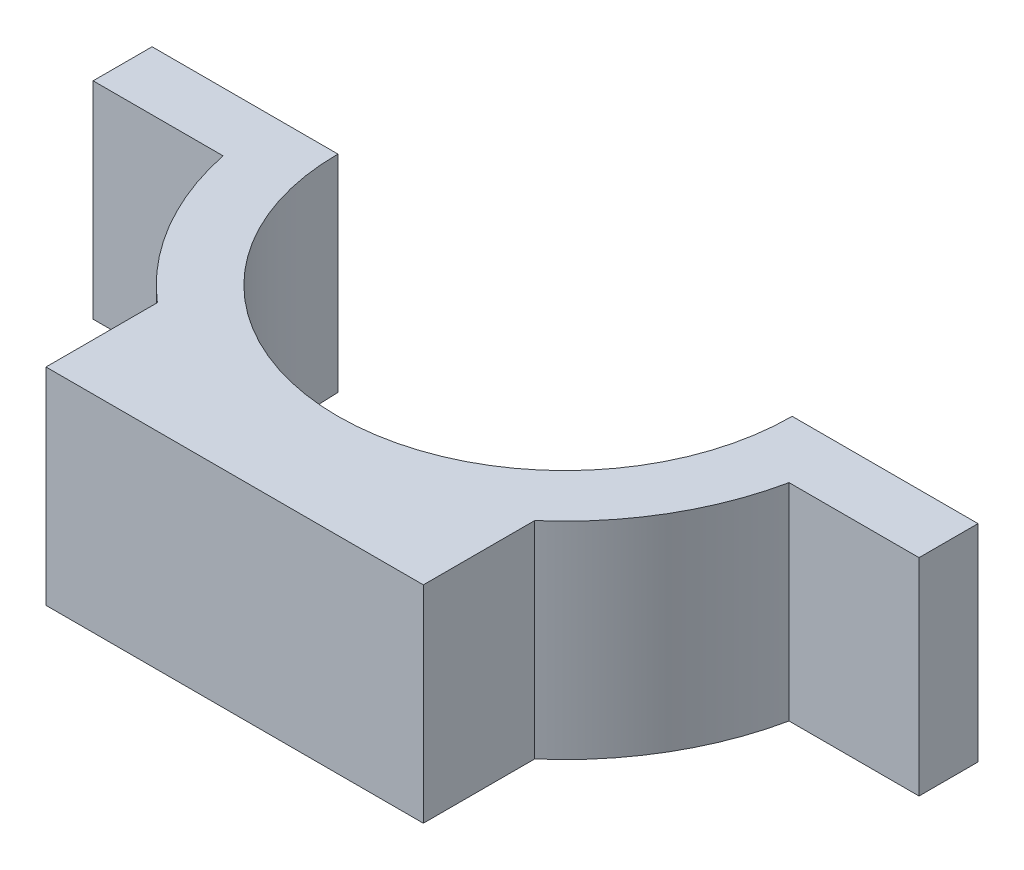
ISO-10303-21;
HEADER;
FILE_DESCRIPTION(('STEP AP214'),'2;1');
FILE_NAME('part.step','',(''),(''),'','','');
FILE_SCHEMA(('AUTOMOTIVE_DESIGN { 1 0 10303 214 1 1 1 1 }'));
ENDSEC;
DATA;
#1=APPLICATION_CONTEXT('core data for automotive mechanical design processes');
#2=APPLICATION_PROTOCOL_DEFINITION('international standard','automotive_design',2000,#1);
#3=PRODUCT_CONTEXT('',#1,'mechanical');
#4=PRODUCT('Part','Part','',(#3));
#5=PRODUCT_RELATED_PRODUCT_CATEGORY('part','',(#4));
#6=PRODUCT_DEFINITION_FORMATION('','',#4);
#7=PRODUCT_DEFINITION_CONTEXT('part definition',#1,'design');
#8=PRODUCT_DEFINITION('design','',#6,#7);
#9=PRODUCT_DEFINITION_SHAPE('','',#8);
#10=(LENGTH_UNIT() NAMED_UNIT(*) SI_UNIT(.MILLI.,.METRE.));
#11=(NAMED_UNIT(*) PLANE_ANGLE_UNIT() SI_UNIT($,.RADIAN.));
#12=(NAMED_UNIT(*) SI_UNIT($,.STERADIAN.) SOLID_ANGLE_UNIT());
#13=UNCERTAINTY_MEASURE_WITH_UNIT(LENGTH_MEASURE(1.E-05),#10,'distance_accuracy_value','');
#14=(GEOMETRIC_REPRESENTATION_CONTEXT(3) GLOBAL_UNCERTAINTY_ASSIGNED_CONTEXT((#13)) GLOBAL_UNIT_ASSIGNED_CONTEXT((#10,
#11,#12)) REPRESENTATION_CONTEXT('',''));
#15=CARTESIAN_POINT('',(0.,0.,0.));
#16=DIRECTION('',(0.,0.,1.));
#17=DIRECTION('',(1.,0.,0.));
#18=AXIS2_PLACEMENT_3D('',#15,#16,#17);
#19=CARTESIAN_POINT('',(0.,50.,0.));
#20=DIRECTION('',(0.,-1.,0.));
#21=DIRECTION('',(0.,0.,-1.));
#22=AXIS2_PLACEMENT_3D('',#19,#20,#21);
#23=CYLINDRICAL_SURFACE('',#22,55.);
#24=CARTESIAN_POINT('',(0.,50.,0.));
#25=DIRECTION('',(0.,1.,0.));
#26=DIRECTION('',(0.,0.,1.));
#27=AXIS2_PLACEMENT_3D('',#24,#25,#26);
#28=CIRCLE('',#27,55.);
#29=CARTESIAN_POINT('',(-55.,50.,0.));
#30=VERTEX_POINT('',#29);
#31=CARTESIAN_POINT('',(55.,50.,0.));
#32=VERTEX_POINT('',#31);
#33=EDGE_CURVE('E208',#30,#32,#28,.T.);
#34=ORIENTED_EDGE('',*,*,#33,.T.);
#35=DIRECTION('',(0.,1.,0.));
#36=VECTOR('',#35,1.);
#37=CARTESIAN_POINT('',(55.,-150.,0.));
#38=LINE('',#37,#36);
#39=CARTESIAN_POINT('',(55.,0.,0.));
#40=VERTEX_POINT('',#39);
#41=EDGE_CURVE('E167',#40,#32,#38,.T.);
#42=ORIENTED_EDGE('',*,*,#41,.F.);
#43=CARTESIAN_POINT('',(0.,0.,0.));
#44=DIRECTION('',(0.,1.,0.));
#45=DIRECTION('',(0.,0.,1.));
#46=AXIS2_PLACEMENT_3D('',#43,#44,#45);
#47=CIRCLE('',#46,55.);
#48=CARTESIAN_POINT('',(-55.,0.,0.));
#49=VERTEX_POINT('',#48);
#50=EDGE_CURVE('E207',#49,#40,#47,.T.);
#51=ORIENTED_EDGE('',*,*,#50,.F.);
#52=DIRECTION('',(0.,1.,0.));
#53=VECTOR('',#52,1.);
#54=CARTESIAN_POINT('',(-55.,-150.,0.));
#55=LINE('',#54,#53);
#56=EDGE_CURVE('E164',#30,#49,#55,.F.);
#57=ORIENTED_EDGE('',*,*,#56,.F.);
#58=EDGE_LOOP('',(#34,#42,#51,#57));
#59=FACE_BOUND('',#58,.T.);
#60=ADVANCED_FACE('F45',(#59),#23,.F.);
#61=CARTESIAN_POINT('',(0.,50.,0.));
#62=DIRECTION('',(0.,-1.,0.));
#63=DIRECTION('',(0.,0.,-1.));
#64=AXIS2_PLACEMENT_3D('',#61,#62,#63);
#65=CYLINDRICAL_SURFACE('',#64,70.);
#66=DIRECTION('',(0.,-1.,0.));
#67=VECTOR('',#66,1.);
#68=CARTESIAN_POINT('',(45.6895550732827,50.,53.0326744300669));
#69=LINE('',#68,#67);
#70=CARTESIAN_POINT('',(45.6895550732827,0.,53.0326744300669));
#71=VERTEX_POINT('',#70);
#72=CARTESIAN_POINT('',(45.6895550732827,50.,53.0326744300669));
#73=VERTEX_POINT('',#72);
#74=EDGE_CURVE('E156',#71,#73,#69,.F.);
#75=ORIENTED_EDGE('',*,*,#74,.F.);
#76=CARTESIAN_POINT('',(0.,0.,0.));
#77=DIRECTION('',(0.,1.,0.));
#78=DIRECTION('',(0.,0.,1.));
#79=AXIS2_PLACEMENT_3D('',#76,#77,#78);
#80=CIRCLE('',#79,70.);
#81=CARTESIAN_POINT('',(68.5275141136973,0.,14.2821500271149));
#82=VERTEX_POINT('',#81);
#83=EDGE_CURVE('E214',#71,#82,#80,.T.);
#84=ORIENTED_EDGE('',*,*,#83,.T.);
#85=DIRECTION('',(0.,-1.,0.));
#86=VECTOR('',#85,1.);
#87=CARTESIAN_POINT('',(68.5275141136973,50.,14.2821500271149));
#88=LINE('',#87,#86);
#89=CARTESIAN_POINT('',(68.5275141136973,50.,14.2821500271149));
#90=VERTEX_POINT('',#89);
#91=EDGE_CURVE('E204',#90,#82,#88,.T.);
#92=ORIENTED_EDGE('',*,*,#91,.F.);
#93=CARTESIAN_POINT('',(0.,50.,0.));
#94=DIRECTION('',(0.,1.,0.));
#95=DIRECTION('',(0.,0.,1.));
#96=AXIS2_PLACEMENT_3D('',#93,#94,#95);
#97=CIRCLE('',#96,70.);
#98=EDGE_CURVE('E53',#73,#90,#97,.T.);
#99=ORIENTED_EDGE('',*,*,#98,.F.);
#100=EDGE_LOOP('',(#75,#84,#92,#99));
#101=FACE_BOUND('',#100,.T.);
#102=ADVANCED_FACE('F222',(#101),#65,.T.);
#103=DIRECTION('',(0.,-1.,0.));
#104=VECTOR('',#103,1.);
#105=CARTESIAN_POINT('',(-45.6895550732827,50.,53.0326744300669));
#106=LINE('',#105,#104);
#107=CARTESIAN_POINT('',(-45.6895550732827,50.,53.0326744300669));
#108=VERTEX_POINT('',#107);
#109=CARTESIAN_POINT('',(-45.6895550732827,0.,53.0326744300669));
#110=VERTEX_POINT('',#109);
#111=EDGE_CURVE('E68',#108,#110,#106,.T.);
#112=ORIENTED_EDGE('',*,*,#111,.F.);
#113=CARTESIAN_POINT('',(-68.5275141136973,50.,14.2821500271149));
#114=VERTEX_POINT('',#113);
#115=EDGE_CURVE('E11',#114,#108,#97,.T.);
#116=ORIENTED_EDGE('',*,*,#115,.F.);
#117=DIRECTION('',(0.,-1.,0.));
#118=VECTOR('',#117,1.);
#119=CARTESIAN_POINT('',(-68.5275141136973,50.,14.2821500271149));
#120=LINE('',#119,#118);
#121=CARTESIAN_POINT('',(-68.5275141136973,0.,14.2821500271149));
#122=VERTEX_POINT('',#121);
#123=EDGE_CURVE('E197',#122,#114,#120,.F.);
#124=ORIENTED_EDGE('',*,*,#123,.F.);
#125=EDGE_CURVE('E48',#122,#110,#80,.T.);
#126=ORIENTED_EDGE('',*,*,#125,.T.);
#127=EDGE_LOOP('',(#112,#116,#124,#126));
#128=FACE_BOUND('',#127,.T.);
#129=ADVANCED_FACE('F249',(#128),#65,.T.);
#130=CARTESIAN_POINT('',(0.,50.,0.));
#131=DIRECTION('',(0.,0.,1.));
#132=DIRECTION('',(1.,0.,0.));
#133=AXIS2_PLACEMENT_3D('',#130,#131,#132);
#134=PLANE('',#133);
#135=DIRECTION('',(-1.,0.,0.));
#136=VECTOR('',#135,1.);
#137=CARTESIAN_POINT('',(0.,0.,0.));
#138=LINE('',#137,#136);
#139=CARTESIAN_POINT('',(100.,0.,0.));
#140=VERTEX_POINT('',#139);
#141=EDGE_CURVE('E211',#140,#40,#138,.T.);
#142=ORIENTED_EDGE('',*,*,#141,.T.);
#143=ORIENTED_EDGE('',*,*,#41,.T.);
#144=DIRECTION('',(-1.,0.,0.));
#145=VECTOR('',#144,1.);
#146=CARTESIAN_POINT('',(0.,50.,0.));
#147=LINE('',#146,#145);
#148=CARTESIAN_POINT('',(100.,50.,0.));
#149=VERTEX_POINT('',#148);
#150=EDGE_CURVE('E212',#149,#32,#147,.T.);
#151=ORIENTED_EDGE('',*,*,#150,.F.);
#152=DIRECTION('',(0.,-1.,0.));
#153=VECTOR('',#152,1.);
#154=CARTESIAN_POINT('',(100.,50.,0.));
#155=LINE('',#154,#153);
#156=EDGE_CURVE('E174',#149,#140,#155,.T.);
#157=ORIENTED_EDGE('',*,*,#156,.T.);
#158=EDGE_LOOP('',(#142,#143,#151,#157));
#159=FACE_BOUND('',#158,.T.);
#160=ADVANCED_FACE('F234',(#159),#134,.F.);
#161=CARTESIAN_POINT('',(-100.,50.,0.));
#162=VERTEX_POINT('',#161);
#163=EDGE_CURVE('E210',#30,#162,#147,.T.);
#164=ORIENTED_EDGE('',*,*,#163,.F.);
#165=ORIENTED_EDGE('',*,*,#56,.T.);
#166=CARTESIAN_POINT('',(-100.,0.,0.));
#167=VERTEX_POINT('',#166);
#168=EDGE_CURVE('E216',#49,#167,#138,.T.);
#169=ORIENTED_EDGE('',*,*,#168,.T.);
#170=DIRECTION('',(0.,-1.,0.));
#171=VECTOR('',#170,1.);
#172=CARTESIAN_POINT('',(-100.,50.,0.));
#173=LINE('',#172,#171);
#174=EDGE_CURVE('E186',#162,#167,#173,.T.);
#175=ORIENTED_EDGE('',*,*,#174,.F.);
#176=EDGE_LOOP('',(#164,#165,#169,#175));
#177=FACE_BOUND('',#176,.T.);
#178=ADVANCED_FACE('F240',(#177),#134,.F.);
#179=CARTESIAN_POINT('',(0.,50.,0.));
#180=DIRECTION('',(0.,1.,0.));
#181=DIRECTION('',(0.,0.,1.));
#182=AXIS2_PLACEMENT_3D('',#179,#180,#181);
#183=PLANE('',#182);
#184=ORIENTED_EDGE('',*,*,#150,.T.);
#185=ORIENTED_EDGE('',*,*,#33,.F.);
#186=ORIENTED_EDGE('',*,*,#163,.T.);
#187=DIRECTION('',(0.,0.,-1.));
#188=VECTOR('',#187,1.);
#189=CARTESIAN_POINT('',(-100.,50.,14.2821500271149));
#190=LINE('',#189,#188);
#191=CARTESIAN_POINT('',(-100.,50.,14.2821500271149));
#192=VERTEX_POINT('',#191);
#193=EDGE_CURVE('E170',#192,#162,#190,.T.);
#194=ORIENTED_EDGE('',*,*,#193,.F.);
#195=DIRECTION('',(-1.,0.,0.));
#196=VECTOR('',#195,1.);
#197=CARTESIAN_POINT('',(100.,50.,14.2821500271149));
#198=LINE('',#197,#196);
#199=EDGE_CURVE('E198',#114,#192,#198,.T.);
#200=ORIENTED_EDGE('',*,*,#199,.F.);
#201=ORIENTED_EDGE('',*,*,#115,.T.);
#202=DIRECTION('',(0.,0.,-1.));
#203=VECTOR('',#202,1.);
#204=CARTESIAN_POINT('',(-45.6895550732827,50.,80.));
#205=LINE('',#204,#203);
#206=CARTESIAN_POINT('',(-45.6895550732827,50.,80.));
#207=VERTEX_POINT('',#206);
#208=EDGE_CURVE('E141',#207,#108,#205,.T.);
#209=ORIENTED_EDGE('',*,*,#208,.F.);
#210=DIRECTION('',(-1.,0.,0.));
#211=VECTOR('',#210,1.);
#212=CARTESIAN_POINT('',(-45.6895550732827,50.,80.));
#213=LINE('',#212,#211);
#214=CARTESIAN_POINT('',(45.6895550732827,50.,80.));
#215=VERTEX_POINT('',#214);
#216=EDGE_CURVE('E134',#215,#207,#213,.T.);
#217=ORIENTED_EDGE('',*,*,#216,.F.);
#218=DIRECTION('',(0.,0.,-1.));
#219=VECTOR('',#218,1.);
#220=CARTESIAN_POINT('',(45.6895550732827,50.,80.));
#221=LINE('',#220,#219);
#222=EDGE_CURVE('E139',#215,#73,#221,.T.);
#223=ORIENTED_EDGE('',*,*,#222,.T.);
#224=ORIENTED_EDGE('',*,*,#98,.T.);
#225=CARTESIAN_POINT('',(100.,50.,14.2821500271149));
#226=VERTEX_POINT('',#225);
#227=EDGE_CURVE('E194',#226,#90,#198,.T.);
#228=ORIENTED_EDGE('',*,*,#227,.F.);
#229=DIRECTION('',(0.,0.,-1.));
#230=VECTOR('',#229,1.);
#231=CARTESIAN_POINT('',(100.,50.,14.2821500271149));
#232=LINE('',#231,#230);
#233=EDGE_CURVE('E171',#226,#149,#232,.T.);
#234=ORIENTED_EDGE('',*,*,#233,.T.);
#235=EDGE_LOOP('',(#184,#185,#186,#194,#200,#201,#209,#217,#223,#224,#228,#234));
#236=FACE_BOUND('',#235,.T.);
#237=ADVANCED_FACE('F137',(#236),#183,.T.);
#238=CARTESIAN_POINT('',(0.,0.,0.));
#239=DIRECTION('',(0.,1.,0.));
#240=DIRECTION('',(0.,0.,1.));
#241=AXIS2_PLACEMENT_3D('',#238,#239,#240);
#242=PLANE('',#241);
#243=ORIENTED_EDGE('',*,*,#50,.T.);
#244=ORIENTED_EDGE('',*,*,#141,.F.);
#245=DIRECTION('',(0.,0.,-1.));
#246=VECTOR('',#245,1.);
#247=CARTESIAN_POINT('',(100.,0.,14.2821500271149));
#248=LINE('',#247,#246);
#249=CARTESIAN_POINT('',(100.,0.,14.2821500271149));
#250=VERTEX_POINT('',#249);
#251=EDGE_CURVE('E178',#250,#140,#248,.T.);
#252=ORIENTED_EDGE('',*,*,#251,.F.);
#253=DIRECTION('',(-1.,0.,0.));
#254=VECTOR('',#253,1.);
#255=CARTESIAN_POINT('',(100.,0.,14.2821500271149));
#256=LINE('',#255,#254);
#257=EDGE_CURVE('E199',#250,#82,#256,.T.);
#258=ORIENTED_EDGE('',*,*,#257,.T.);
#259=ORIENTED_EDGE('',*,*,#83,.F.);
#260=DIRECTION('',(0.,0.,-1.));
#261=VECTOR('',#260,1.);
#262=CARTESIAN_POINT('',(45.6895550732827,0.,80.));
#263=LINE('',#262,#261);
#264=CARTESIAN_POINT('',(45.6895550732827,0.,80.));
#265=VERTEX_POINT('',#264);
#266=EDGE_CURVE('E253',#265,#71,#263,.T.);
#267=ORIENTED_EDGE('',*,*,#266,.F.);
#268=DIRECTION('',(1.,0.,0.));
#269=VECTOR('',#268,1.);
#270=CARTESIAN_POINT('',(-45.6895550732827,0.,80.));
#271=LINE('',#270,#269);
#272=CARTESIAN_POINT('',(-45.6895550732827,0.,80.));
#273=VERTEX_POINT('',#272);
#274=EDGE_CURVE('E150',#273,#265,#271,.T.);
#275=ORIENTED_EDGE('',*,*,#274,.F.);
#276=DIRECTION('',(0.,0.,-1.));
#277=VECTOR('',#276,1.);
#278=CARTESIAN_POINT('',(-45.6895550732827,0.,80.));
#279=LINE('',#278,#277);
#280=EDGE_CURVE('E159',#273,#110,#279,.T.);
#281=ORIENTED_EDGE('',*,*,#280,.T.);
#282=ORIENTED_EDGE('',*,*,#125,.F.);
#283=CARTESIAN_POINT('',(-100.,0.,14.2821500271149));
#284=VERTEX_POINT('',#283);
#285=EDGE_CURVE('E183',#122,#284,#256,.T.);
#286=ORIENTED_EDGE('',*,*,#285,.T.);
#287=DIRECTION('',(0.,0.,-1.));
#288=VECTOR('',#287,1.);
#289=CARTESIAN_POINT('',(-100.,0.,14.2821500271149));
#290=LINE('',#289,#288);
#291=EDGE_CURVE('E189',#284,#167,#290,.T.);
#292=ORIENTED_EDGE('',*,*,#291,.T.);
#293=ORIENTED_EDGE('',*,*,#168,.F.);
#294=EDGE_LOOP('',(#243,#244,#252,#258,#259,#267,#275,#281,#282,#286,#292,#293));
#295=FACE_BOUND('',#294,.T.);
#296=ADVANCED_FACE('F229',(#295),#242,.F.);
#297=CARTESIAN_POINT('',(-100.,0.,0.));
#298=DIRECTION('',(-1.,0.,0.));
#299=DIRECTION('',(0.,0.,1.));
#300=AXIS2_PLACEMENT_3D('',#297,#298,#299);
#301=PLANE('',#300);
#302=ORIENTED_EDGE('',*,*,#193,.T.);
#303=ORIENTED_EDGE('',*,*,#174,.T.);
#304=ORIENTED_EDGE('',*,*,#291,.F.);
#305=DIRECTION('',(0.,-1.,0.));
#306=VECTOR('',#305,1.);
#307=CARTESIAN_POINT('',(-100.,50.,14.2821500271149));
#308=LINE('',#307,#306);
#309=EDGE_CURVE('E175',#192,#284,#308,.T.);
#310=ORIENTED_EDGE('',*,*,#309,.F.);
#311=EDGE_LOOP('',(#302,#303,#304,#310));
#312=FACE_BOUND('',#311,.T.);
#313=ADVANCED_FACE('F244',(#312),#301,.T.);
#314=CARTESIAN_POINT('',(100.,50.,14.2821500271149));
#315=DIRECTION('',(0.,0.,-1.));
#316=DIRECTION('',(-1.,0.,0.));
#317=AXIS2_PLACEMENT_3D('',#314,#315,#316);
#318=PLANE('',#317);
#319=ORIENTED_EDGE('',*,*,#285,.F.);
#320=ORIENTED_EDGE('',*,*,#123,.T.);
#321=ORIENTED_EDGE('',*,*,#199,.T.);
#322=ORIENTED_EDGE('',*,*,#309,.T.);
#323=EDGE_LOOP('',(#319,#320,#321,#322));
#324=FACE_BOUND('',#323,.T.);
#325=ADVANCED_FACE('F248',(#324),#318,.F.);
#326=CARTESIAN_POINT('',(100.,0.,0.));
#327=DIRECTION('',(-1.,0.,0.));
#328=DIRECTION('',(0.,0.,1.));
#329=AXIS2_PLACEMENT_3D('',#326,#327,#328);
#330=PLANE('',#329);
#331=ORIENTED_EDGE('',*,*,#233,.F.);
#332=DIRECTION('',(0.,-1.,0.));
#333=VECTOR('',#332,1.);
#334=CARTESIAN_POINT('',(100.,50.,14.2821500271149));
#335=LINE('',#334,#333);
#336=EDGE_CURVE('E181',#226,#250,#335,.T.);
#337=ORIENTED_EDGE('',*,*,#336,.T.);
#338=ORIENTED_EDGE('',*,*,#251,.T.);
#339=ORIENTED_EDGE('',*,*,#156,.F.);
#340=EDGE_LOOP('',(#331,#337,#338,#339));
#341=FACE_BOUND('',#340,.T.);
#342=ADVANCED_FACE('F233',(#341),#330,.F.);
#343=ORIENTED_EDGE('',*,*,#227,.T.);
#344=ORIENTED_EDGE('',*,*,#91,.T.);
#345=ORIENTED_EDGE('',*,*,#257,.F.);
#346=ORIENTED_EDGE('',*,*,#336,.F.);
#347=EDGE_LOOP('',(#343,#344,#345,#346));
#348=FACE_BOUND('',#347,.T.);
#349=ADVANCED_FACE('F226',(#348),#318,.F.);
#350=CARTESIAN_POINT('',(0.,0.,80.));
#351=DIRECTION('',(0.,0.,1.));
#352=DIRECTION('',(1.,0.,0.));
#353=AXIS2_PLACEMENT_3D('',#350,#351,#352);
#354=PLANE('',#353);
#355=DIRECTION('',(0.,1.,0.));
#356=VECTOR('',#355,1.);
#357=CARTESIAN_POINT('',(45.6895550732827,50.,80.));
#358=LINE('',#357,#356);
#359=EDGE_CURVE('E145',#265,#215,#358,.T.);
#360=ORIENTED_EDGE('',*,*,#359,.T.);
#361=ORIENTED_EDGE('',*,*,#216,.T.);
#362=DIRECTION('',(0.,-1.,0.));
#363=VECTOR('',#362,1.);
#364=CARTESIAN_POINT('',(-45.6895550732827,50.,80.));
#365=LINE('',#364,#363);
#366=EDGE_CURVE('E144',#207,#273,#365,.T.);
#367=ORIENTED_EDGE('',*,*,#366,.T.);
#368=ORIENTED_EDGE('',*,*,#274,.T.);
#369=EDGE_LOOP('',(#360,#361,#367,#368));
#370=FACE_BOUND('',#369,.T.);
#371=ADVANCED_FACE('F148',(#370),#354,.T.);
#372=CARTESIAN_POINT('',(-45.6895550732827,50.,80.));
#373=DIRECTION('',(1.,0.,0.));
#374=DIRECTION('',(0.,0.,-1.));
#375=AXIS2_PLACEMENT_3D('',#372,#373,#374);
#376=PLANE('',#375);
#377=ORIENTED_EDGE('',*,*,#208,.T.);
#378=ORIENTED_EDGE('',*,*,#111,.T.);
#379=ORIENTED_EDGE('',*,*,#280,.F.);
#380=ORIENTED_EDGE('',*,*,#366,.F.);
#381=EDGE_LOOP('',(#377,#378,#379,#380));
#382=FACE_BOUND('',#381,.T.);
#383=ADVANCED_FACE('F257',(#382),#376,.F.);
#384=CARTESIAN_POINT('',(45.6895550732827,50.,80.));
#385=DIRECTION('',(-1.,0.,0.));
#386=DIRECTION('',(0.,0.,1.));
#387=AXIS2_PLACEMENT_3D('',#384,#385,#386);
#388=PLANE('',#387);
#389=ORIENTED_EDGE('',*,*,#266,.T.);
#390=ORIENTED_EDGE('',*,*,#74,.T.);
#391=ORIENTED_EDGE('',*,*,#222,.F.);
#392=ORIENTED_EDGE('',*,*,#359,.F.);
#393=EDGE_LOOP('',(#389,#390,#391,#392));
#394=FACE_BOUND('',#393,.T.);
#395=ADVANCED_FACE('F155',(#394),#388,.F.);
#396=CLOSED_SHELL('',(#60,#102,#129,#160,#178,#237,#296,#313,#325,#342,#349,#371,#383,#395));
#397=MANIFOLD_SOLID_BREP('B2',#396);
#398=ADVANCED_BREP_SHAPE_REPRESENTATION('',(#18,#397),#14);
#399=SHAPE_DEFINITION_REPRESENTATION(#9,#398);
ENDSEC;
END-ISO-10303-21;
